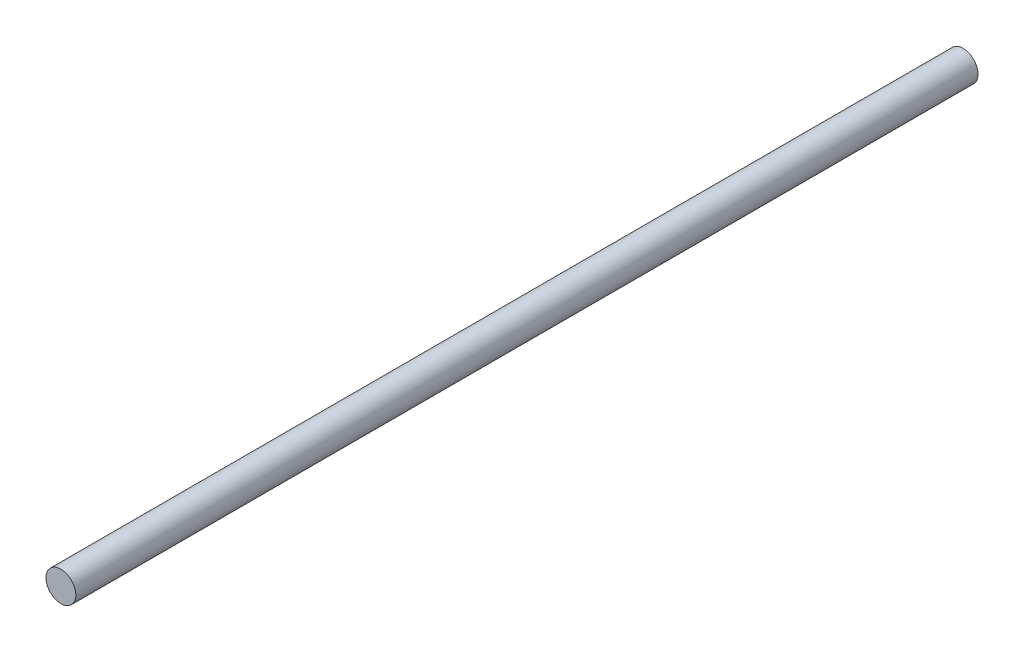
ISO-10303-21;
HEADER;
FILE_DESCRIPTION(('STEP AP214'),'2;1');
FILE_NAME('part.step','',(''),(''),'','','');
FILE_SCHEMA(('AUTOMOTIVE_DESIGN { 1 0 10303 214 1 1 1 1 }'));
ENDSEC;
DATA;
#1=APPLICATION_CONTEXT('core data for automotive mechanical design processes');
#2=APPLICATION_PROTOCOL_DEFINITION('international standard','automotive_design',2000,#1);
#3=PRODUCT_CONTEXT('',#1,'mechanical');
#4=PRODUCT('Part','Part','',(#3));
#5=PRODUCT_RELATED_PRODUCT_CATEGORY('part','',(#4));
#6=PRODUCT_DEFINITION_FORMATION('','',#4);
#7=PRODUCT_DEFINITION_CONTEXT('part definition',#1,'design');
#8=PRODUCT_DEFINITION('design','',#6,#7);
#9=PRODUCT_DEFINITION_SHAPE('','',#8);
#10=(LENGTH_UNIT() NAMED_UNIT(*) SI_UNIT(.MILLI.,.METRE.));
#11=(NAMED_UNIT(*) PLANE_ANGLE_UNIT() SI_UNIT($,.RADIAN.));
#12=(NAMED_UNIT(*) SI_UNIT($,.STERADIAN.) SOLID_ANGLE_UNIT());
#13=UNCERTAINTY_MEASURE_WITH_UNIT(LENGTH_MEASURE(1.E-05),#10,'distance_accuracy_value','');
#14=(GEOMETRIC_REPRESENTATION_CONTEXT(3) GLOBAL_UNCERTAINTY_ASSIGNED_CONTEXT((#13)) GLOBAL_UNIT_ASSIGNED_CONTEXT((#10,
#11,#12)) REPRESENTATION_CONTEXT('',''));
#15=CARTESIAN_POINT('',(0.,0.,0.));
#16=DIRECTION('',(0.,0.,1.));
#17=DIRECTION('',(1.,0.,0.));
#18=AXIS2_PLACEMENT_3D('',#15,#16,#17);
#19=CARTESIAN_POINT('',(0.,0.,241.52));
#20=DIRECTION('',(0.,0.,-1.));
#21=DIRECTION('',(-1.,0.,0.));
#22=AXIS2_PLACEMENT_3D('',#19,#20,#21);
#23=CYLINDRICAL_SURFACE('',#22,4.);
#24=CARTESIAN_POINT('',(0.,0.,241.52));
#25=DIRECTION('',(0.,0.,1.));
#26=DIRECTION('',(1.,0.,0.));
#27=AXIS2_PLACEMENT_3D('',#24,#25,#26);
#28=CIRCLE('',#27,4.);
#29=CARTESIAN_POINT('',(4.,0.,241.52));
#30=VERTEX_POINT('',#29);
#31=EDGE_CURVE('E10',#30,#30,#28,.T.);
#32=ORIENTED_EDGE('',*,*,#31,.F.);
#33=EDGE_LOOP('',(#32));
#34=FACE_BOUND('',#33,.T.);
#35=CARTESIAN_POINT('',(0.,0.,0.));
#36=DIRECTION('',(0.,0.,1.));
#37=DIRECTION('',(1.,0.,0.));
#38=AXIS2_PLACEMENT_3D('',#35,#36,#37);
#39=CIRCLE('',#38,4.);
#40=CARTESIAN_POINT('',(4.,0.,0.));
#41=VERTEX_POINT('',#40);
#42=EDGE_CURVE('E34',#41,#41,#39,.T.);
#43=ORIENTED_EDGE('',*,*,#42,.T.);
#44=EDGE_LOOP('',(#43));
#45=FACE_BOUND('',#44,.T.);
#46=ADVANCED_FACE('F31',(#34,#45),#23,.T.);
#47=CARTESIAN_POINT('',(0.,0.,241.52));
#48=DIRECTION('',(0.,0.,1.));
#49=DIRECTION('',(1.,0.,0.));
#50=AXIS2_PLACEMENT_3D('',#47,#48,#49);
#51=PLANE('',#50);
#52=ORIENTED_EDGE('',*,*,#31,.T.);
#53=EDGE_LOOP('',(#52));
#54=FACE_BOUND('',#53,.T.);
#55=ADVANCED_FACE('F46',(#54),#51,.T.);
#56=CARTESIAN_POINT('',(0.,0.,0.));
#57=DIRECTION('',(0.,0.,1.));
#58=DIRECTION('',(1.,0.,0.));
#59=AXIS2_PLACEMENT_3D('',#56,#57,#58);
#60=PLANE('',#59);
#61=ORIENTED_EDGE('',*,*,#42,.F.);
#62=EDGE_LOOP('',(#61));
#63=FACE_BOUND('',#62,.T.);
#64=ADVANCED_FACE('F44',(#63),#60,.F.);
#65=CLOSED_SHELL('',(#46,#55,#64));
#66=MANIFOLD_SOLID_BREP('B2',#65);
#67=ADVANCED_BREP_SHAPE_REPRESENTATION('',(#18,#66),#14);
#68=SHAPE_DEFINITION_REPRESENTATION(#9,#67);
ENDSEC;
END-ISO-10303-21;
